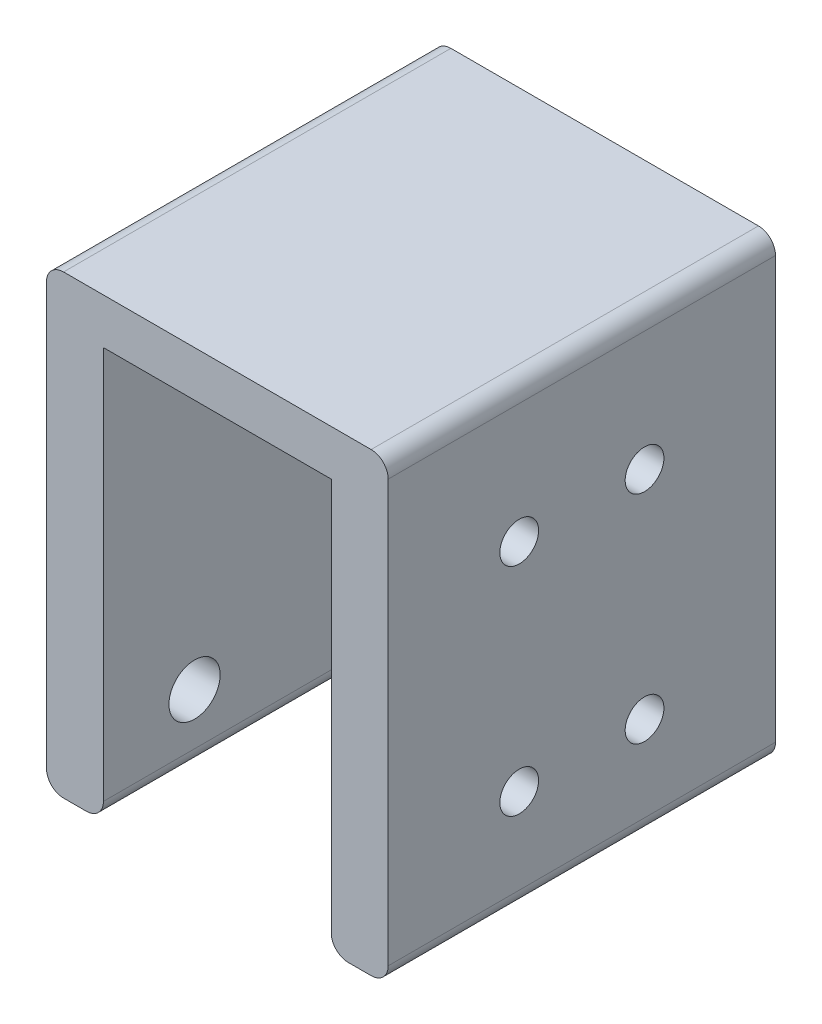
ISO-10303-21;
HEADER;
FILE_DESCRIPTION(('STEP AP214'),'2;1');
FILE_NAME('part.step','',(''),(''),'','','');
FILE_SCHEMA(('AUTOMOTIVE_DESIGN { 1 0 10303 214 1 1 1 1 }'));
ENDSEC;
DATA;
#1=APPLICATION_CONTEXT('core data for automotive mechanical design processes');
#2=APPLICATION_PROTOCOL_DEFINITION('international standard','automotive_design',2000,#1);
#3=PRODUCT_CONTEXT('',#1,'mechanical');
#4=PRODUCT('Part','Part','',(#3));
#5=PRODUCT_RELATED_PRODUCT_CATEGORY('part','',(#4));
#6=PRODUCT_DEFINITION_FORMATION('','',#4);
#7=PRODUCT_DEFINITION_CONTEXT('part definition',#1,'design');
#8=PRODUCT_DEFINITION('design','',#6,#7);
#9=PRODUCT_DEFINITION_SHAPE('','',#8);
#10=(LENGTH_UNIT() NAMED_UNIT(*) SI_UNIT(.MILLI.,.METRE.));
#11=(NAMED_UNIT(*) PLANE_ANGLE_UNIT() SI_UNIT($,.RADIAN.));
#12=(NAMED_UNIT(*) SI_UNIT($,.STERADIAN.) SOLID_ANGLE_UNIT());
#13=UNCERTAINTY_MEASURE_WITH_UNIT(LENGTH_MEASURE(1.E-05),#10,'distance_accuracy_value','');
#14=(GEOMETRIC_REPRESENTATION_CONTEXT(3) GLOBAL_UNCERTAINTY_ASSIGNED_CONTEXT((#13)) GLOBAL_UNIT_ASSIGNED_CONTEXT((#10,
#11,#12)) REPRESENTATION_CONTEXT('',''));
#15=CARTESIAN_POINT('',(0.,0.,0.));
#16=DIRECTION('',(0.,0.,1.));
#17=DIRECTION('',(1.,0.,0.));
#18=AXIS2_PLACEMENT_3D('',#15,#16,#17);
#19=CARTESIAN_POINT('',(5.,0.,0.));
#20=DIRECTION('',(-1.,0.,0.));
#21=DIRECTION('',(0.,0.,1.));
#22=AXIS2_PLACEMENT_3D('',#19,#20,#21);
#23=PLANE('',#22);
#24=CARTESIAN_POINT('',(5.,6.,-26.));
#25=DIRECTION('',(1.,0.,0.));
#26=DIRECTION('',(0.,0.,-1.));
#27=AXIS2_PLACEMENT_3D('',#24,#25,#26);
#28=CIRCLE('',#27,2.25000000000001);
#29=CARTESIAN_POINT('',(5.,6.,-28.25));
#30=VERTEX_POINT('',#29);
#31=EDGE_CURVE('E176',#30,#30,#28,.T.);
#32=ORIENTED_EDGE('',*,*,#31,.F.);
#33=EDGE_LOOP('',(#32));
#34=FACE_BOUND('',#33,.T.);
#35=CARTESIAN_POINT('',(5.,32.,-26.));
#36=DIRECTION('',(1.,0.,0.));
#37=DIRECTION('',(0.,0.,-1.));
#38=AXIS2_PLACEMENT_3D('',#35,#36,#37);
#39=CIRCLE('',#38,2.25000000000001);
#40=CARTESIAN_POINT('',(5.,32.,-28.25));
#41=VERTEX_POINT('',#40);
#42=EDGE_CURVE('E182',#41,#41,#39,.T.);
#43=ORIENTED_EDGE('',*,*,#42,.F.);
#44=EDGE_LOOP('',(#43));
#45=FACE_BOUND('',#44,.T.);
#46=CARTESIAN_POINT('',(5.,6.,-8.));
#47=DIRECTION('',(1.,0.,0.));
#48=DIRECTION('',(0.,0.,-1.));
#49=AXIS2_PLACEMENT_3D('',#46,#47,#48);
#50=CIRCLE('',#49,2.25);
#51=CARTESIAN_POINT('',(5.,6.,-10.25));
#52=VERTEX_POINT('',#51);
#53=EDGE_CURVE('E188',#52,#52,#50,.T.);
#54=ORIENTED_EDGE('',*,*,#53,.F.);
#55=EDGE_LOOP('',(#54));
#56=FACE_BOUND('',#55,.T.);
#57=CARTESIAN_POINT('',(5.,32.,-8.));
#58=DIRECTION('',(1.,0.,0.));
#59=DIRECTION('',(0.,0.,-1.));
#60=AXIS2_PLACEMENT_3D('',#57,#58,#59);
#61=CIRCLE('',#60,2.25000000000001);
#62=CARTESIAN_POINT('',(5.,32.,-10.25));
#63=VERTEX_POINT('',#62);
#64=EDGE_CURVE('E194',#63,#63,#61,.T.);
#65=ORIENTED_EDGE('',*,*,#64,.F.);
#66=EDGE_LOOP('',(#65));
#67=FACE_BOUND('',#66,.T.);
#68=DIRECTION('',(0.,-1.,0.));
#69=VECTOR('',#68,1.);
#70=CARTESIAN_POINT('',(5.,0.,0.));
#71=LINE('',#70,#69);
#72=CARTESIAN_POINT('',(5.,36.,0.));
#73=VERTEX_POINT('',#72);
#74=CARTESIAN_POINT('',(5.,1.5,0.));
#75=VERTEX_POINT('',#74);
#76=EDGE_CURVE('E200',#73,#75,#71,.T.);
#77=ORIENTED_EDGE('',*,*,#76,.T.);
#78=DIRECTION('',(0.,0.,-1.));
#79=VECTOR('',#78,1.);
#80=CARTESIAN_POINT('',(5.,1.5,0.));
#81=LINE('',#80,#79);
#82=CARTESIAN_POINT('',(5.,1.5,-34.));
#83=VERTEX_POINT('',#82);
#84=EDGE_CURVE('E264',#75,#83,#81,.T.);
#85=ORIENTED_EDGE('',*,*,#84,.T.);
#86=DIRECTION('',(0.,1.,0.));
#87=VECTOR('',#86,1.);
#88=CARTESIAN_POINT('',(5.,0.,-34.));
#89=LINE('',#88,#87);
#90=CARTESIAN_POINT('',(5.,36.,-34.));
#91=VERTEX_POINT('',#90);
#92=EDGE_CURVE('E203',#83,#91,#89,.T.);
#93=ORIENTED_EDGE('',*,*,#92,.T.);
#94=DIRECTION('',(0.,0.,-1.));
#95=VECTOR('',#94,1.);
#96=CARTESIAN_POINT('',(5.,36.,0.));
#97=LINE('',#96,#95);
#98=EDGE_CURVE('E162',#73,#91,#97,.T.);
#99=ORIENTED_EDGE('',*,*,#98,.F.);
#100=EDGE_LOOP('',(#77,#85,#93,#99));
#101=FACE_BOUND('',#100,.T.);
#102=ADVANCED_FACE('F42',(#34,#45,#56,#67,#101),#23,.F.);
#103=CARTESIAN_POINT('',(0.,0.,0.));
#104=DIRECTION('',(-1.,0.,0.));
#105=DIRECTION('',(0.,0.,1.));
#106=AXIS2_PLACEMENT_3D('',#103,#104,#105);
#107=PLANE('',#106);
#108=CARTESIAN_POINT('',(0.,32.,-26.));
#109=DIRECTION('',(1.,0.,0.));
#110=DIRECTION('',(0.,0.,-1.));
#111=AXIS2_PLACEMENT_3D('',#108,#109,#110);
#112=CIRCLE('',#111,2.25000000000001);
#113=CARTESIAN_POINT('',(0.,32.,-28.25));
#114=VERTEX_POINT('',#113);
#115=EDGE_CURVE('E179',#114,#114,#112,.T.);
#116=ORIENTED_EDGE('',*,*,#115,.T.);
#117=EDGE_LOOP('',(#116));
#118=FACE_BOUND('',#117,.T.);
#119=CARTESIAN_POINT('',(0.,32.,-8.));
#120=DIRECTION('',(1.,0.,0.));
#121=DIRECTION('',(0.,0.,-1.));
#122=AXIS2_PLACEMENT_3D('',#119,#120,#121);
#123=CIRCLE('',#122,2.25000000000001);
#124=CARTESIAN_POINT('',(0.,32.,-10.25));
#125=VERTEX_POINT('',#124);
#126=EDGE_CURVE('E191',#125,#125,#123,.T.);
#127=ORIENTED_EDGE('',*,*,#126,.T.);
#128=EDGE_LOOP('',(#127));
#129=FACE_BOUND('',#128,.T.);
#130=DIRECTION('',(0.,-1.,0.));
#131=VECTOR('',#130,1.);
#132=CARTESIAN_POINT('',(0.,0.,0.));
#133=LINE('',#132,#131);
#134=CARTESIAN_POINT('',(0.,38.5,0.));
#135=VERTEX_POINT('',#134);
#136=CARTESIAN_POINT('',(0.,1.5,0.));
#137=VERTEX_POINT('',#136);
#138=EDGE_CURVE('E197',#135,#137,#133,.T.);
#139=ORIENTED_EDGE('',*,*,#138,.F.);
#140=DIRECTION('',(0.,0.,1.));
#141=VECTOR('',#140,1.);
#142=CARTESIAN_POINT('',(0.,38.5,-34.));
#143=LINE('',#142,#141);
#144=CARTESIAN_POINT('',(0.,38.5,-34.));
#145=VERTEX_POINT('',#144);
#146=EDGE_CURVE('E255',#135,#145,#143,.F.);
#147=ORIENTED_EDGE('',*,*,#146,.T.);
#148=DIRECTION('',(0.,1.,0.));
#149=VECTOR('',#148,1.);
#150=CARTESIAN_POINT('',(0.,0.,-34.));
#151=LINE('',#150,#149);
#152=CARTESIAN_POINT('',(0.,1.5,-34.));
#153=VERTEX_POINT('',#152);
#154=EDGE_CURVE('E204',#153,#145,#151,.T.);
#155=ORIENTED_EDGE('',*,*,#154,.F.);
#156=DIRECTION('',(0.,0.,-1.));
#157=VECTOR('',#156,1.);
#158=CARTESIAN_POINT('',(0.,1.5,0.));
#159=LINE('',#158,#157);
#160=EDGE_CURVE('E253',#153,#137,#159,.F.);
#161=ORIENTED_EDGE('',*,*,#160,.T.);
#162=EDGE_LOOP('',(#139,#147,#155,#161));
#163=FACE_BOUND('',#162,.T.);
#164=CARTESIAN_POINT('',(0.,6.,-8.));
#165=DIRECTION('',(1.,0.,0.));
#166=DIRECTION('',(0.,0.,-1.));
#167=AXIS2_PLACEMENT_3D('',#164,#165,#166);
#168=CIRCLE('',#167,2.25);
#169=CARTESIAN_POINT('',(0.,6.,-10.25));
#170=VERTEX_POINT('',#169);
#171=EDGE_CURVE('E185',#170,#170,#168,.T.);
#172=ORIENTED_EDGE('',*,*,#171,.T.);
#173=EDGE_LOOP('',(#172));
#174=FACE_BOUND('',#173,.T.);
#175=CARTESIAN_POINT('',(0.,6.,-26.));
#176=DIRECTION('',(1.,0.,0.));
#177=DIRECTION('',(0.,0.,-1.));
#178=AXIS2_PLACEMENT_3D('',#175,#176,#177);
#179=CIRCLE('',#178,2.25000000000001);
#180=CARTESIAN_POINT('',(0.,6.,-28.25));
#181=VERTEX_POINT('',#180);
#182=EDGE_CURVE('E175',#181,#181,#179,.T.);
#183=ORIENTED_EDGE('',*,*,#182,.T.);
#184=EDGE_LOOP('',(#183));
#185=FACE_BOUND('',#184,.T.);
#186=ADVANCED_FACE('F275',(#118,#129,#163,#174,#185),#107,.T.);
#187=CARTESIAN_POINT('',(5.,0.,0.));
#188=DIRECTION('',(0.,0.,-1.));
#189=DIRECTION('',(-1.,0.,0.));
#190=AXIS2_PLACEMENT_3D('',#187,#188,#189);
#191=PLANE('',#190);
#192=DIRECTION('',(0.,-1.,0.));
#193=VECTOR('',#192,1.);
#194=CARTESIAN_POINT('',(30.,40.,0.));
#195=LINE('',#194,#193);
#196=CARTESIAN_POINT('',(30.,38.5,0.));
#197=VERTEX_POINT('',#196);
#198=CARTESIAN_POINT('',(30.,1.5,0.));
#199=VERTEX_POINT('',#198);
#200=EDGE_CURVE('E153',#197,#199,#195,.T.);
#201=ORIENTED_EDGE('',*,*,#200,.F.);
#202=CARTESIAN_POINT('',(28.5,38.5,0.));
#203=DIRECTION('',(0.,0.,-1.));
#204=DIRECTION('',(-1.,0.,0.));
#205=AXIS2_PLACEMENT_3D('',#202,#203,#204);
#206=CIRCLE('',#205,1.5);
#207=CARTESIAN_POINT('',(28.5,40.,0.));
#208=VERTEX_POINT('',#207);
#209=EDGE_CURVE('E237',#197,#208,#206,.F.);
#210=ORIENTED_EDGE('',*,*,#209,.T.);
#211=DIRECTION('',(-1.,0.,0.));
#212=VECTOR('',#211,1.);
#213=CARTESIAN_POINT('',(5.,40.,0.));
#214=LINE('',#213,#212);
#215=CARTESIAN_POINT('',(1.5,40.,0.));
#216=VERTEX_POINT('',#215);
#217=EDGE_CURVE('E206',#208,#216,#214,.T.);
#218=ORIENTED_EDGE('',*,*,#217,.T.);
#219=CARTESIAN_POINT('',(1.5,38.5,0.));
#220=DIRECTION('',(0.,0.,-1.));
#221=DIRECTION('',(-1.,0.,0.));
#222=AXIS2_PLACEMENT_3D('',#219,#220,#221);
#223=CIRCLE('',#222,1.5);
#224=EDGE_CURVE('E235',#216,#135,#223,.F.);
#225=ORIENTED_EDGE('',*,*,#224,.T.);
#226=ORIENTED_EDGE('',*,*,#138,.T.);
#227=CARTESIAN_POINT('',(1.5,1.5,0.));
#228=DIRECTION('',(0.,0.,-1.));
#229=DIRECTION('',(-1.,0.,0.));
#230=AXIS2_PLACEMENT_3D('',#227,#228,#229);
#231=CIRCLE('',#230,1.5);
#232=CARTESIAN_POINT('',(1.5,0.,0.));
#233=VERTEX_POINT('',#232);
#234=EDGE_CURVE('E227',#137,#233,#231,.F.);
#235=ORIENTED_EDGE('',*,*,#234,.T.);
#236=DIRECTION('',(-1.,0.,0.));
#237=VECTOR('',#236,1.);
#238=CARTESIAN_POINT('',(5.,0.,0.));
#239=LINE('',#238,#237);
#240=CARTESIAN_POINT('',(3.5,0.,0.));
#241=VERTEX_POINT('',#240);
#242=EDGE_CURVE('E218',#241,#233,#239,.T.);
#243=ORIENTED_EDGE('',*,*,#242,.F.);
#244=CARTESIAN_POINT('',(3.5,1.5,0.));
#245=DIRECTION('',(0.,0.,-1.));
#246=DIRECTION('',(-1.,0.,0.));
#247=AXIS2_PLACEMENT_3D('',#244,#245,#246);
#248=CIRCLE('',#247,1.5);
#249=EDGE_CURVE('E229',#241,#75,#248,.F.);
#250=ORIENTED_EDGE('',*,*,#249,.T.);
#251=ORIENTED_EDGE('',*,*,#76,.F.);
#252=DIRECTION('',(-1.,0.,0.));
#253=VECTOR('',#252,1.);
#254=CARTESIAN_POINT('',(25.,36.,0.));
#255=LINE('',#254,#253);
#256=CARTESIAN_POINT('',(25.,36.,0.));
#257=VERTEX_POINT('',#256);
#258=EDGE_CURVE('E163',#257,#73,#255,.T.);
#259=ORIENTED_EDGE('',*,*,#258,.F.);
#260=DIRECTION('',(0.,-1.,0.));
#261=VECTOR('',#260,1.);
#262=CARTESIAN_POINT('',(25.,40.,0.));
#263=LINE('',#262,#261);
#264=CARTESIAN_POINT('',(25.,1.5,0.));
#265=VERTEX_POINT('',#264);
#266=EDGE_CURVE('E154',#257,#265,#263,.T.);
#267=ORIENTED_EDGE('',*,*,#266,.T.);
#268=CARTESIAN_POINT('',(26.5,1.5,0.));
#269=DIRECTION('',(0.,0.,-1.));
#270=DIRECTION('',(-1.,0.,0.));
#271=AXIS2_PLACEMENT_3D('',#268,#269,#270);
#272=CIRCLE('',#271,1.5);
#273=CARTESIAN_POINT('',(26.5,0.,0.));
#274=VERTEX_POINT('',#273);
#275=EDGE_CURVE('E233',#265,#274,#272,.F.);
#276=ORIENTED_EDGE('',*,*,#275,.T.);
#277=DIRECTION('',(-1.,0.,0.));
#278=VECTOR('',#277,1.);
#279=CARTESIAN_POINT('',(30.,0.,0.));
#280=LINE('',#279,#278);
#281=CARTESIAN_POINT('',(28.5,0.,0.));
#282=VERTEX_POINT('',#281);
#283=EDGE_CURVE('E169',#282,#274,#280,.T.);
#284=ORIENTED_EDGE('',*,*,#283,.F.);
#285=CARTESIAN_POINT('',(28.5,1.5,0.));
#286=DIRECTION('',(0.,0.,-1.));
#287=DIRECTION('',(-1.,0.,0.));
#288=AXIS2_PLACEMENT_3D('',#285,#286,#287);
#289=CIRCLE('',#288,1.5);
#290=EDGE_CURVE('E231',#282,#199,#289,.F.);
#291=ORIENTED_EDGE('',*,*,#290,.T.);
#292=EDGE_LOOP('',(#201,#210,#218,#225,#226,#235,#243,#250,#251,#259,#267,#276,#284,#291));
#293=FACE_BOUND('',#292,.T.);
#294=ADVANCED_FACE('F280',(#293),#191,.F.);
#295=CARTESIAN_POINT('',(5.,0.,0.));
#296=DIRECTION('',(0.,1.,0.));
#297=DIRECTION('',(0.,0.,1.));
#298=AXIS2_PLACEMENT_3D('',#295,#296,#297);
#299=PLANE('',#298);
#300=DIRECTION('',(-1.,0.,0.));
#301=VECTOR('',#300,1.);
#302=CARTESIAN_POINT('',(5.,0.,-34.));
#303=LINE('',#302,#301);
#304=CARTESIAN_POINT('',(3.5,0.,-34.));
#305=VERTEX_POINT('',#304);
#306=CARTESIAN_POINT('',(1.5,0.,-34.));
#307=VERTEX_POINT('',#306);
#308=EDGE_CURVE('E216',#305,#307,#303,.T.);
#309=ORIENTED_EDGE('',*,*,#308,.F.);
#310=DIRECTION('',(0.,0.,-1.));
#311=VECTOR('',#310,1.);
#312=CARTESIAN_POINT('',(3.5,0.,0.));
#313=LINE('',#312,#311);
#314=EDGE_CURVE('E11',#305,#241,#313,.F.);
#315=ORIENTED_EDGE('',*,*,#314,.T.);
#316=ORIENTED_EDGE('',*,*,#242,.T.);
#317=DIRECTION('',(0.,0.,-1.));
#318=VECTOR('',#317,1.);
#319=CARTESIAN_POINT('',(1.5,0.,-34.));
#320=LINE('',#319,#318);
#321=EDGE_CURVE('E50',#233,#307,#320,.T.);
#322=ORIENTED_EDGE('',*,*,#321,.T.);
#323=EDGE_LOOP('',(#309,#315,#316,#322));
#324=FACE_BOUND('',#323,.T.);
#325=ADVANCED_FACE('F267',(#324),#299,.F.);
#326=CARTESIAN_POINT('',(5.,0.,-34.));
#327=DIRECTION('',(0.,0.,1.));
#328=DIRECTION('',(1.,0.,0.));
#329=AXIS2_PLACEMENT_3D('',#326,#327,#328);
#330=PLANE('',#329);
#331=DIRECTION('',(-1.,0.,0.));
#332=VECTOR('',#331,1.);
#333=CARTESIAN_POINT('',(5.,40.,-34.));
#334=LINE('',#333,#332);
#335=CARTESIAN_POINT('',(28.5,40.,-34.));
#336=VERTEX_POINT('',#335);
#337=CARTESIAN_POINT('',(1.5,40.,-34.));
#338=VERTEX_POINT('',#337);
#339=EDGE_CURVE('E213',#336,#338,#334,.T.);
#340=ORIENTED_EDGE('',*,*,#339,.F.);
#341=CARTESIAN_POINT('',(28.5,38.5,-34.));
#342=DIRECTION('',(0.,0.,1.));
#343=DIRECTION('',(1.,0.,0.));
#344=AXIS2_PLACEMENT_3D('',#341,#342,#343);
#345=CIRCLE('',#344,1.5);
#346=CARTESIAN_POINT('',(30.,38.5,-34.));
#347=VERTEX_POINT('',#346);
#348=EDGE_CURVE('E251',#336,#347,#345,.F.);
#349=ORIENTED_EDGE('',*,*,#348,.T.);
#350=DIRECTION('',(0.,1.,0.));
#351=VECTOR('',#350,1.);
#352=CARTESIAN_POINT('',(30.,40.,-34.));
#353=LINE('',#352,#351);
#354=CARTESIAN_POINT('',(30.,1.5,-34.));
#355=VERTEX_POINT('',#354);
#356=EDGE_CURVE('E295',#355,#347,#353,.T.);
#357=ORIENTED_EDGE('',*,*,#356,.F.);
#358=CARTESIAN_POINT('',(28.5,1.5,-34.));
#359=DIRECTION('',(0.,0.,1.));
#360=DIRECTION('',(1.,0.,0.));
#361=AXIS2_PLACEMENT_3D('',#358,#359,#360);
#362=CIRCLE('',#361,1.5);
#363=CARTESIAN_POINT('',(28.5,0.,-34.));
#364=VERTEX_POINT('',#363);
#365=EDGE_CURVE('E246',#355,#364,#362,.F.);
#366=ORIENTED_EDGE('',*,*,#365,.T.);
#367=DIRECTION('',(-1.,0.,0.));
#368=VECTOR('',#367,1.);
#369=CARTESIAN_POINT('',(30.,0.,-34.));
#370=LINE('',#369,#368);
#371=CARTESIAN_POINT('',(26.5,0.,-34.));
#372=VERTEX_POINT('',#371);
#373=EDGE_CURVE('E300',#364,#372,#370,.T.);
#374=ORIENTED_EDGE('',*,*,#373,.T.);
#375=CARTESIAN_POINT('',(26.5,1.5,-34.));
#376=DIRECTION('',(0.,0.,1.));
#377=DIRECTION('',(1.,0.,0.));
#378=AXIS2_PLACEMENT_3D('',#375,#376,#377);
#379=CIRCLE('',#378,1.5);
#380=CARTESIAN_POINT('',(25.,1.5,-34.));
#381=VERTEX_POINT('',#380);
#382=EDGE_CURVE('E149',#372,#381,#379,.F.);
#383=ORIENTED_EDGE('',*,*,#382,.T.);
#384=DIRECTION('',(0.,1.,0.));
#385=VECTOR('',#384,1.);
#386=CARTESIAN_POINT('',(25.,40.,-34.));
#387=LINE('',#386,#385);
#388=CARTESIAN_POINT('',(25.,36.,-34.));
#389=VERTEX_POINT('',#388);
#390=EDGE_CURVE('E143',#381,#389,#387,.T.);
#391=ORIENTED_EDGE('',*,*,#390,.T.);
#392=DIRECTION('',(-1.,0.,0.));
#393=VECTOR('',#392,1.);
#394=CARTESIAN_POINT('',(25.,36.,-34.));
#395=LINE('',#394,#393);
#396=EDGE_CURVE('E147',#389,#91,#395,.T.);
#397=ORIENTED_EDGE('',*,*,#396,.T.);
#398=ORIENTED_EDGE('',*,*,#92,.F.);
#399=CARTESIAN_POINT('',(3.5,1.5,-34.));
#400=DIRECTION('',(0.,0.,1.));
#401=DIRECTION('',(1.,0.,0.));
#402=AXIS2_PLACEMENT_3D('',#399,#400,#401);
#403=CIRCLE('',#402,1.5);
#404=EDGE_CURVE('E65',#83,#305,#403,.F.);
#405=ORIENTED_EDGE('',*,*,#404,.T.);
#406=ORIENTED_EDGE('',*,*,#308,.T.);
#407=CARTESIAN_POINT('',(1.5,1.5,-34.));
#408=DIRECTION('',(0.,0.,1.));
#409=DIRECTION('',(1.,0.,0.));
#410=AXIS2_PLACEMENT_3D('',#407,#408,#409);
#411=CIRCLE('',#410,1.5);
#412=EDGE_CURVE('E57',#307,#153,#411,.F.);
#413=ORIENTED_EDGE('',*,*,#412,.T.);
#414=ORIENTED_EDGE('',*,*,#154,.T.);
#415=CARTESIAN_POINT('',(1.5,38.5,-34.));
#416=DIRECTION('',(0.,0.,1.));
#417=DIRECTION('',(1.,0.,0.));
#418=AXIS2_PLACEMENT_3D('',#415,#416,#417);
#419=CIRCLE('',#418,1.5);
#420=EDGE_CURVE('E249',#145,#338,#419,.F.);
#421=ORIENTED_EDGE('',*,*,#420,.T.);
#422=EDGE_LOOP('',(#340,#349,#357,#366,#374,#383,#391,#397,#398,#405,#406,#413,#414,#421));
#423=FACE_BOUND('',#422,.T.);
#424=ADVANCED_FACE('F146',(#423),#330,.F.);
#425=CARTESIAN_POINT('',(5.,40.,0.));
#426=DIRECTION('',(0.,-1.,0.));
#427=DIRECTION('',(0.,0.,-1.));
#428=AXIS2_PLACEMENT_3D('',#425,#426,#427);
#429=PLANE('',#428);
#430=ORIENTED_EDGE('',*,*,#217,.F.);
#431=DIRECTION('',(0.,0.,1.));
#432=VECTOR('',#431,1.);
#433=CARTESIAN_POINT('',(28.5,40.,-34.));
#434=LINE('',#433,#432);
#435=EDGE_CURVE('E242',#208,#336,#434,.F.);
#436=ORIENTED_EDGE('',*,*,#435,.T.);
#437=ORIENTED_EDGE('',*,*,#339,.T.);
#438=DIRECTION('',(0.,0.,1.));
#439=VECTOR('',#438,1.);
#440=CARTESIAN_POINT('',(1.5,40.,0.));
#441=LINE('',#440,#439);
#442=EDGE_CURVE('E239',#338,#216,#441,.T.);
#443=ORIENTED_EDGE('',*,*,#442,.T.);
#444=EDGE_LOOP('',(#430,#436,#437,#443));
#445=FACE_BOUND('',#444,.T.);
#446=ADVANCED_FACE('F288',(#445),#429,.F.);
#447=CARTESIAN_POINT('',(5.,32.,-8.));
#448=DIRECTION('',(-1.,0.,0.));
#449=DIRECTION('',(0.,0.,1.));
#450=AXIS2_PLACEMENT_3D('',#447,#448,#449);
#451=CYLINDRICAL_SURFACE('',#450,2.25000000000001);
#452=ORIENTED_EDGE('',*,*,#64,.T.);
#453=EDGE_LOOP('',(#452));
#454=FACE_BOUND('',#453,.T.);
#455=ORIENTED_EDGE('',*,*,#126,.F.);
#456=EDGE_LOOP('',(#455));
#457=FACE_BOUND('',#456,.T.);
#458=ADVANCED_FACE('F366',(#454,#457),#451,.F.);
#459=CARTESIAN_POINT('',(5.,6.,-8.));
#460=DIRECTION('',(-1.,0.,0.));
#461=DIRECTION('',(0.,0.,1.));
#462=AXIS2_PLACEMENT_3D('',#459,#460,#461);
#463=CYLINDRICAL_SURFACE('',#462,2.25);
#464=ORIENTED_EDGE('',*,*,#53,.T.);
#465=EDGE_LOOP('',(#464));
#466=FACE_BOUND('',#465,.T.);
#467=ORIENTED_EDGE('',*,*,#171,.F.);
#468=EDGE_LOOP('',(#467));
#469=FACE_BOUND('',#468,.T.);
#470=ADVANCED_FACE('F569',(#466,#469),#463,.F.);
#471=CARTESIAN_POINT('',(5.,32.,-26.));
#472=DIRECTION('',(-1.,0.,0.));
#473=DIRECTION('',(0.,0.,1.));
#474=AXIS2_PLACEMENT_3D('',#471,#472,#473);
#475=CYLINDRICAL_SURFACE('',#474,2.25000000000001);
#476=ORIENTED_EDGE('',*,*,#42,.T.);
#477=EDGE_LOOP('',(#476));
#478=FACE_BOUND('',#477,.T.);
#479=ORIENTED_EDGE('',*,*,#115,.F.);
#480=EDGE_LOOP('',(#479));
#481=FACE_BOUND('',#480,.T.);
#482=ADVANCED_FACE('F559',(#478,#481),#475,.F.);
#483=CARTESIAN_POINT('',(5.,6.,-26.));
#484=DIRECTION('',(-1.,0.,0.));
#485=DIRECTION('',(0.,0.,1.));
#486=AXIS2_PLACEMENT_3D('',#483,#484,#485);
#487=CYLINDRICAL_SURFACE('',#486,2.25000000000001);
#488=ORIENTED_EDGE('',*,*,#31,.T.);
#489=EDGE_LOOP('',(#488));
#490=FACE_BOUND('',#489,.T.);
#491=ORIENTED_EDGE('',*,*,#182,.F.);
#492=EDGE_LOOP('',(#491));
#493=FACE_BOUND('',#492,.T.);
#494=ADVANCED_FACE('F493',(#490,#493),#487,.F.);
#495=CARTESIAN_POINT('',(25.,36.,0.));
#496=DIRECTION('',(0.,1.,0.));
#497=DIRECTION('',(0.,0.,1.));
#498=AXIS2_PLACEMENT_3D('',#495,#496,#497);
#499=PLANE('',#498);
#500=ORIENTED_EDGE('',*,*,#98,.T.);
#501=ORIENTED_EDGE('',*,*,#396,.F.);
#502=DIRECTION('',(0.,0.,-1.));
#503=VECTOR('',#502,1.);
#504=CARTESIAN_POINT('',(25.,36.,0.));
#505=LINE('',#504,#503);
#506=EDGE_CURVE('E160',#257,#389,#505,.T.);
#507=ORIENTED_EDGE('',*,*,#506,.F.);
#508=ORIENTED_EDGE('',*,*,#258,.T.);
#509=EDGE_LOOP('',(#500,#501,#507,#508));
#510=FACE_BOUND('',#509,.T.);
#511=ADVANCED_FACE('F158',(#510),#499,.F.);
#512=CARTESIAN_POINT('',(25.,0.,0.));
#513=DIRECTION('',(1.,0.,0.));
#514=DIRECTION('',(0.,0.,-1.));
#515=AXIS2_PLACEMENT_3D('',#512,#513,#514);
#516=PLANE('',#515);
#517=CARTESIAN_POINT('',(25.,28.,-22.5));
#518=DIRECTION('',(1.,0.,0.));
#519=DIRECTION('',(0.,0.,-1.));
#520=AXIS2_PLACEMENT_3D('',#517,#518,#519);
#521=CIRCLE('',#520,1.7);
#522=CARTESIAN_POINT('',(25.,28.,-24.2));
#523=VERTEX_POINT('',#522);
#524=EDGE_CURVE('E322',#523,#523,#521,.T.);
#525=ORIENTED_EDGE('',*,*,#524,.T.);
#526=EDGE_LOOP('',(#525));
#527=FACE_BOUND('',#526,.T.);
#528=CARTESIAN_POINT('',(25.,9.,-11.5));
#529=DIRECTION('',(1.,0.,0.));
#530=DIRECTION('',(0.,0.,-1.));
#531=AXIS2_PLACEMENT_3D('',#528,#529,#530);
#532=CIRCLE('',#531,1.7);
#533=CARTESIAN_POINT('',(25.,9.,-13.2));
#534=VERTEX_POINT('',#533);
#535=EDGE_CURVE('E315',#534,#534,#532,.T.);
#536=ORIENTED_EDGE('',*,*,#535,.T.);
#537=EDGE_LOOP('',(#536));
#538=FACE_BOUND('',#537,.T.);
#539=CARTESIAN_POINT('',(25.,9.,-22.5));
#540=DIRECTION('',(1.,0.,0.));
#541=DIRECTION('',(0.,0.,-1.));
#542=AXIS2_PLACEMENT_3D('',#539,#540,#541);
#543=CIRCLE('',#542,1.7);
#544=CARTESIAN_POINT('',(25.,9.,-24.2));
#545=VERTEX_POINT('',#544);
#546=EDGE_CURVE('E327',#545,#545,#543,.T.);
#547=ORIENTED_EDGE('',*,*,#546,.T.);
#548=EDGE_LOOP('',(#547));
#549=FACE_BOUND('',#548,.T.);
#550=CARTESIAN_POINT('',(25.,28.,-11.5));
#551=DIRECTION('',(1.,0.,0.));
#552=DIRECTION('',(0.,0.,-1.));
#553=AXIS2_PLACEMENT_3D('',#550,#551,#552);
#554=CIRCLE('',#553,1.7);
#555=CARTESIAN_POINT('',(25.,28.,-13.2));
#556=VERTEX_POINT('',#555);
#557=EDGE_CURVE('E305',#556,#556,#554,.T.);
#558=ORIENTED_EDGE('',*,*,#557,.T.);
#559=EDGE_LOOP('',(#558));
#560=FACE_BOUND('',#559,.T.);
#561=ORIENTED_EDGE('',*,*,#390,.F.);
#562=DIRECTION('',(0.,0.,-1.));
#563=VECTOR('',#562,1.);
#564=CARTESIAN_POINT('',(25.,1.5,0.));
#565=LINE('',#564,#563);
#566=EDGE_CURVE('E262',#381,#265,#565,.F.);
#567=ORIENTED_EDGE('',*,*,#566,.T.);
#568=ORIENTED_EDGE('',*,*,#266,.F.);
#569=ORIENTED_EDGE('',*,*,#506,.T.);
#570=EDGE_LOOP('',(#561,#567,#568,#569));
#571=FACE_BOUND('',#570,.T.);
#572=ADVANCED_FACE('F166',(#527,#538,#549,#560,#571),#516,.F.);
#573=CARTESIAN_POINT('',(30.,0.,0.));
#574=DIRECTION('',(0.,1.,0.));
#575=DIRECTION('',(0.,0.,1.));
#576=AXIS2_PLACEMENT_3D('',#573,#574,#575);
#577=PLANE('',#576);
#578=ORIENTED_EDGE('',*,*,#283,.T.);
#579=DIRECTION('',(0.,0.,-1.));
#580=VECTOR('',#579,1.);
#581=CARTESIAN_POINT('',(26.5,0.,0.));
#582=LINE('',#581,#580);
#583=EDGE_CURVE('E259',#274,#372,#582,.T.);
#584=ORIENTED_EDGE('',*,*,#583,.T.);
#585=ORIENTED_EDGE('',*,*,#373,.F.);
#586=DIRECTION('',(0.,0.,-1.));
#587=VECTOR('',#586,1.);
#588=CARTESIAN_POINT('',(28.5,0.,0.));
#589=LINE('',#588,#587);
#590=EDGE_CURVE('E257',#364,#282,#589,.F.);
#591=ORIENTED_EDGE('',*,*,#590,.T.);
#592=EDGE_LOOP('',(#578,#584,#585,#591));
#593=FACE_BOUND('',#592,.T.);
#594=ADVANCED_FACE('F338',(#593),#577,.F.);
#595=CARTESIAN_POINT('',(30.,0.,0.));
#596=DIRECTION('',(1.,0.,0.));
#597=DIRECTION('',(0.,0.,-1.));
#598=AXIS2_PLACEMENT_3D('',#595,#596,#597);
#599=PLANE('',#598);
#600=CARTESIAN_POINT('',(30.,28.,-22.5));
#601=DIRECTION('',(1.,0.,0.));
#602=DIRECTION('',(0.,0.,-1.));
#603=AXIS2_PLACEMENT_3D('',#600,#601,#602);
#604=CIRCLE('',#603,1.7);
#605=CARTESIAN_POINT('',(30.,28.,-24.2));
#606=VERTEX_POINT('',#605);
#607=EDGE_CURVE('E313',#606,#606,#604,.T.);
#608=ORIENTED_EDGE('',*,*,#607,.F.);
#609=EDGE_LOOP('',(#608));
#610=FACE_BOUND('',#609,.T.);
#611=CARTESIAN_POINT('',(30.,9.,-11.5));
#612=DIRECTION('',(1.,0.,0.));
#613=DIRECTION('',(0.,0.,-1.));
#614=AXIS2_PLACEMENT_3D('',#611,#612,#613);
#615=CIRCLE('',#614,1.7);
#616=CARTESIAN_POINT('',(30.,9.,-13.2));
#617=VERTEX_POINT('',#616);
#618=EDGE_CURVE('E318',#617,#617,#615,.T.);
#619=ORIENTED_EDGE('',*,*,#618,.F.);
#620=EDGE_LOOP('',(#619));
#621=FACE_BOUND('',#620,.T.);
#622=CARTESIAN_POINT('',(30.,9.,-22.5));
#623=DIRECTION('',(1.,0.,0.));
#624=DIRECTION('',(0.,0.,-1.));
#625=AXIS2_PLACEMENT_3D('',#622,#623,#624);
#626=CIRCLE('',#625,1.7);
#627=CARTESIAN_POINT('',(30.,9.,-24.2));
#628=VERTEX_POINT('',#627);
#629=EDGE_CURVE('E319',#628,#628,#626,.T.);
#630=ORIENTED_EDGE('',*,*,#629,.F.);
#631=EDGE_LOOP('',(#630));
#632=FACE_BOUND('',#631,.T.);
#633=CARTESIAN_POINT('',(30.,28.,-11.5));
#634=DIRECTION('',(1.,0.,0.));
#635=DIRECTION('',(0.,0.,-1.));
#636=AXIS2_PLACEMENT_3D('',#633,#634,#635);
#637=CIRCLE('',#636,1.7);
#638=CARTESIAN_POINT('',(30.,28.,-13.2));
#639=VERTEX_POINT('',#638);
#640=EDGE_CURVE('E308',#639,#639,#637,.T.);
#641=ORIENTED_EDGE('',*,*,#640,.F.);
#642=EDGE_LOOP('',(#641));
#643=FACE_BOUND('',#642,.T.);
#644=ORIENTED_EDGE('',*,*,#356,.T.);
#645=DIRECTION('',(0.,0.,1.));
#646=VECTOR('',#645,1.);
#647=CARTESIAN_POINT('',(30.,38.5,0.));
#648=LINE('',#647,#646);
#649=EDGE_CURVE('E224',#347,#197,#648,.T.);
#650=ORIENTED_EDGE('',*,*,#649,.T.);
#651=ORIENTED_EDGE('',*,*,#200,.T.);
#652=DIRECTION('',(0.,0.,-1.));
#653=VECTOR('',#652,1.);
#654=CARTESIAN_POINT('',(30.,1.5,-34.));
#655=LINE('',#654,#653);
#656=EDGE_CURVE('E221',#199,#355,#655,.T.);
#657=ORIENTED_EDGE('',*,*,#656,.T.);
#658=EDGE_LOOP('',(#644,#650,#651,#657));
#659=FACE_BOUND('',#658,.T.);
#660=ADVANCED_FACE('F297',(#610,#621,#632,#643,#659),#599,.T.);
#661=CARTESIAN_POINT('',(25.,28.,-11.5));
#662=DIRECTION('',(1.,0.,0.));
#663=DIRECTION('',(0.,0.,-1.));
#664=AXIS2_PLACEMENT_3D('',#661,#662,#663);
#665=CYLINDRICAL_SURFACE('',#664,1.7);
#666=ORIENTED_EDGE('',*,*,#557,.F.);
#667=EDGE_LOOP('',(#666));
#668=FACE_BOUND('',#667,.T.);
#669=ORIENTED_EDGE('',*,*,#640,.T.);
#670=EDGE_LOOP('',(#669));
#671=FACE_BOUND('',#670,.T.);
#672=ADVANCED_FACE('F337',(#668,#671),#665,.F.);
#673=CARTESIAN_POINT('',(25.,9.,-22.5));
#674=DIRECTION('',(1.,0.,0.));
#675=DIRECTION('',(0.,0.,-1.));
#676=AXIS2_PLACEMENT_3D('',#673,#674,#675);
#677=CYLINDRICAL_SURFACE('',#676,1.7);
#678=ORIENTED_EDGE('',*,*,#546,.F.);
#679=EDGE_LOOP('',(#678));
#680=FACE_BOUND('',#679,.T.);
#681=ORIENTED_EDGE('',*,*,#629,.T.);
#682=EDGE_LOOP('',(#681));
#683=FACE_BOUND('',#682,.T.);
#684=ADVANCED_FACE('F333',(#680,#683),#677,.F.);
#685=CARTESIAN_POINT('',(25.,9.,-11.5));
#686=DIRECTION('',(1.,0.,0.));
#687=DIRECTION('',(0.,0.,-1.));
#688=AXIS2_PLACEMENT_3D('',#685,#686,#687);
#689=CYLINDRICAL_SURFACE('',#688,1.7);
#690=ORIENTED_EDGE('',*,*,#535,.F.);
#691=EDGE_LOOP('',(#690));
#692=FACE_BOUND('',#691,.T.);
#693=ORIENTED_EDGE('',*,*,#618,.T.);
#694=EDGE_LOOP('',(#693));
#695=FACE_BOUND('',#694,.T.);
#696=ADVANCED_FACE('F350',(#692,#695),#689,.F.);
#697=CARTESIAN_POINT('',(25.,28.,-22.5));
#698=DIRECTION('',(1.,0.,0.));
#699=DIRECTION('',(0.,0.,-1.));
#700=AXIS2_PLACEMENT_3D('',#697,#698,#699);
#701=CYLINDRICAL_SURFACE('',#700,1.7);
#702=ORIENTED_EDGE('',*,*,#524,.F.);
#703=EDGE_LOOP('',(#702));
#704=FACE_BOUND('',#703,.T.);
#705=ORIENTED_EDGE('',*,*,#607,.T.);
#706=EDGE_LOOP('',(#705));
#707=FACE_BOUND('',#706,.T.);
#708=ADVANCED_FACE('F379',(#704,#707),#701,.F.);
#709=CARTESIAN_POINT('',(28.5,38.5,0.));
#710=DIRECTION('',(0.,0.,-1.));
#711=DIRECTION('',(-1.,0.,0.));
#712=AXIS2_PLACEMENT_3D('',#709,#710,#711);
#713=CYLINDRICAL_SURFACE('',#712,1.5);
#714=ORIENTED_EDGE('',*,*,#348,.F.);
#715=ORIENTED_EDGE('',*,*,#435,.F.);
#716=ORIENTED_EDGE('',*,*,#209,.F.);
#717=ORIENTED_EDGE('',*,*,#649,.F.);
#718=EDGE_LOOP('',(#714,#715,#716,#717));
#719=FACE_BOUND('',#718,.T.);
#720=ADVANCED_FACE('F291',(#719),#713,.T.);
#721=CARTESIAN_POINT('',(1.5,38.5,0.));
#722=DIRECTION('',(0.,0.,-1.));
#723=DIRECTION('',(-1.,0.,0.));
#724=AXIS2_PLACEMENT_3D('',#721,#722,#723);
#725=CYLINDRICAL_SURFACE('',#724,1.5);
#726=ORIENTED_EDGE('',*,*,#420,.F.);
#727=ORIENTED_EDGE('',*,*,#146,.F.);
#728=ORIENTED_EDGE('',*,*,#224,.F.);
#729=ORIENTED_EDGE('',*,*,#442,.F.);
#730=EDGE_LOOP('',(#726,#727,#728,#729));
#731=FACE_BOUND('',#730,.T.);
#732=ADVANCED_FACE('F283',(#731),#725,.T.);
#733=CARTESIAN_POINT('',(26.5,1.5,0.));
#734=DIRECTION('',(0.,0.,-1.));
#735=DIRECTION('',(-1.,0.,0.));
#736=AXIS2_PLACEMENT_3D('',#733,#734,#735);
#737=CYLINDRICAL_SURFACE('',#736,1.5);
#738=ORIENTED_EDGE('',*,*,#275,.F.);
#739=ORIENTED_EDGE('',*,*,#566,.F.);
#740=ORIENTED_EDGE('',*,*,#382,.F.);
#741=ORIENTED_EDGE('',*,*,#583,.F.);
#742=EDGE_LOOP('',(#738,#739,#740,#741));
#743=FACE_BOUND('',#742,.T.);
#744=ADVANCED_FACE('F382',(#743),#737,.T.);
#745=CARTESIAN_POINT('',(28.5,1.5,0.));
#746=DIRECTION('',(0.,0.,1.));
#747=DIRECTION('',(1.,0.,0.));
#748=AXIS2_PLACEMENT_3D('',#745,#746,#747);
#749=CYLINDRICAL_SURFACE('',#748,1.5);
#750=ORIENTED_EDGE('',*,*,#290,.F.);
#751=ORIENTED_EDGE('',*,*,#590,.F.);
#752=ORIENTED_EDGE('',*,*,#365,.F.);
#753=ORIENTED_EDGE('',*,*,#656,.F.);
#754=EDGE_LOOP('',(#750,#751,#752,#753));
#755=FACE_BOUND('',#754,.T.);
#756=ADVANCED_FACE('F385',(#755),#749,.T.);
#757=CARTESIAN_POINT('',(3.5,1.5,0.));
#758=DIRECTION('',(0.,0.,-1.));
#759=DIRECTION('',(-1.,0.,0.));
#760=AXIS2_PLACEMENT_3D('',#757,#758,#759);
#761=CYLINDRICAL_SURFACE('',#760,1.5);
#762=ORIENTED_EDGE('',*,*,#249,.F.);
#763=ORIENTED_EDGE('',*,*,#314,.F.);
#764=ORIENTED_EDGE('',*,*,#404,.F.);
#765=ORIENTED_EDGE('',*,*,#84,.F.);
#766=EDGE_LOOP('',(#762,#763,#764,#765));
#767=FACE_BOUND('',#766,.T.);
#768=ADVANCED_FACE('F388',(#767),#761,.T.);
#769=CARTESIAN_POINT('',(1.5,1.5,0.));
#770=DIRECTION('',(0.,0.,1.));
#771=DIRECTION('',(1.,0.,0.));
#772=AXIS2_PLACEMENT_3D('',#769,#770,#771);
#773=CYLINDRICAL_SURFACE('',#772,1.5);
#774=ORIENTED_EDGE('',*,*,#234,.F.);
#775=ORIENTED_EDGE('',*,*,#160,.F.);
#776=ORIENTED_EDGE('',*,*,#412,.F.);
#777=ORIENTED_EDGE('',*,*,#321,.F.);
#778=EDGE_LOOP('',(#774,#775,#776,#777));
#779=FACE_BOUND('',#778,.T.);
#780=ADVANCED_FACE('F44',(#779),#773,.T.);
#781=CLOSED_SHELL('',(#102,#186,#294,#325,#424,#446,#458,#470,#482,#494,#511,#572,#594,#660,
#672,#684,#696,#708,#720,#732,#744,#756,#768,#780));
#782=MANIFOLD_SOLID_BREP('B2',#781);
#783=ADVANCED_BREP_SHAPE_REPRESENTATION('',(#18,#782),#14);
#784=SHAPE_DEFINITION_REPRESENTATION(#9,#783);
ENDSEC;
END-ISO-10303-21;
